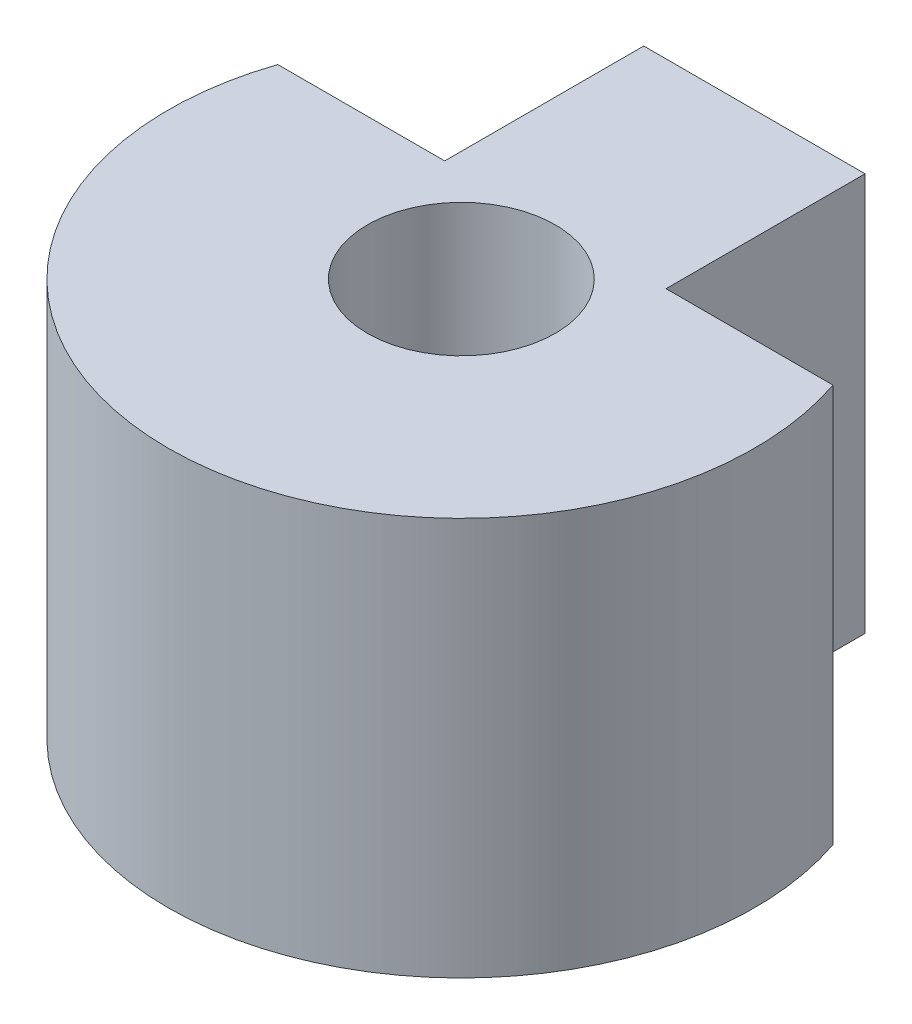
ISO-10303-21;
HEADER;
FILE_DESCRIPTION(('STEP AP214'),'2;1');
FILE_NAME('part.step','',(''),(''),'','','');
FILE_SCHEMA(('AUTOMOTIVE_DESIGN { 1 0 10303 214 1 1 1 1 }'));
ENDSEC;
DATA;
#1=APPLICATION_CONTEXT('core data for automotive mechanical design processes');
#2=APPLICATION_PROTOCOL_DEFINITION('international standard','automotive_design',2000,#1);
#3=PRODUCT_CONTEXT('',#1,'mechanical');
#4=PRODUCT('Part','Part','',(#3));
#5=PRODUCT_RELATED_PRODUCT_CATEGORY('part','',(#4));
#6=PRODUCT_DEFINITION_FORMATION('','',#4);
#7=PRODUCT_DEFINITION_CONTEXT('part definition',#1,'design');
#8=PRODUCT_DEFINITION('design','',#6,#7);
#9=PRODUCT_DEFINITION_SHAPE('','',#8);
#10=(LENGTH_UNIT() NAMED_UNIT(*) SI_UNIT(.MILLI.,.METRE.));
#11=(NAMED_UNIT(*) PLANE_ANGLE_UNIT() SI_UNIT($,.RADIAN.));
#12=(NAMED_UNIT(*) SI_UNIT($,.STERADIAN.) SOLID_ANGLE_UNIT());
#13=UNCERTAINTY_MEASURE_WITH_UNIT(LENGTH_MEASURE(1.E-05),#10,'distance_accuracy_value','');
#14=(GEOMETRIC_REPRESENTATION_CONTEXT(3) GLOBAL_UNCERTAINTY_ASSIGNED_CONTEXT((#13)) GLOBAL_UNIT_ASSIGNED_CONTEXT((#10,
#11,#12)) REPRESENTATION_CONTEXT('',''));
#15=CARTESIAN_POINT('',(0.,0.,0.));
#16=DIRECTION('',(0.,0.,1.));
#17=DIRECTION('',(1.,0.,0.));
#18=AXIS2_PLACEMENT_3D('',#15,#16,#17);
#19=CARTESIAN_POINT('',(0.,6.35,0.));
#20=DIRECTION('',(0.,1.,0.));
#21=DIRECTION('',(0.,0.,1.));
#22=AXIS2_PLACEMENT_3D('',#19,#20,#21);
#23=PLANE('',#22);
#24=DIRECTION('',(-1.,0.,0.));
#25=VECTOR('',#24,1.);
#26=CARTESIAN_POINT('',(-1.7653,6.35,-1.5));
#27=LINE('',#26,#25);
#28=CARTESIAN_POINT('',(-1.7653,6.35,-1.5));
#29=VERTEX_POINT('',#28);
#30=CARTESIAN_POINT('',(-4.42782395765685,6.35,-1.5));
#31=VERTEX_POINT('',#30);
#32=EDGE_CURVE('E126',#29,#31,#27,.T.);
#33=ORIENTED_EDGE('',*,*,#32,.T.);
#34=CARTESIAN_POINT('',(0.,6.35,0.));
#35=DIRECTION('',(0.,1.,0.));
#36=DIRECTION('',(0.,0.,1.));
#37=AXIS2_PLACEMENT_3D('',#34,#35,#36);
#38=CIRCLE('',#37,4.675);
#39=CARTESIAN_POINT('',(4.42782395765685,6.35,-1.5));
#40=VERTEX_POINT('',#39);
#41=EDGE_CURVE('E84',#31,#40,#38,.T.);
#42=ORIENTED_EDGE('',*,*,#41,.T.);
#43=DIRECTION('',(-1.,0.,0.));
#44=VECTOR('',#43,1.);
#45=CARTESIAN_POINT('',(1.7653,6.35,-1.5));
#46=LINE('',#45,#44);
#47=CARTESIAN_POINT('',(1.7653,6.35,-1.5));
#48=VERTEX_POINT('',#47);
#49=EDGE_CURVE('E97',#40,#48,#46,.T.);
#50=ORIENTED_EDGE('',*,*,#49,.T.);
#51=DIRECTION('',(0.,0.,-1.));
#52=VECTOR('',#51,1.);
#53=CARTESIAN_POINT('',(1.7653,6.35,-1.5));
#54=LINE('',#53,#52);
#55=CARTESIAN_POINT('',(1.7653,6.35,-4.675));
#56=VERTEX_POINT('',#55);
#57=EDGE_CURVE('E91',#48,#56,#54,.T.);
#58=ORIENTED_EDGE('',*,*,#57,.T.);
#59=DIRECTION('',(-1.,0.,0.));
#60=VECTOR('',#59,1.);
#61=CARTESIAN_POINT('',(-1.7653,6.35,-4.675));
#62=LINE('',#61,#60);
#63=CARTESIAN_POINT('',(-1.7653,6.35,-4.675));
#64=VERTEX_POINT('',#63);
#65=EDGE_CURVE('E95',#56,#64,#62,.T.);
#66=ORIENTED_EDGE('',*,*,#65,.T.);
#67=DIRECTION('',(0.,0.,1.));
#68=VECTOR('',#67,1.);
#69=CARTESIAN_POINT('',(-1.7653,6.35,-1.5));
#70=LINE('',#69,#68);
#71=EDGE_CURVE('E47',#64,#29,#70,.T.);
#72=ORIENTED_EDGE('',*,*,#71,.T.);
#73=EDGE_LOOP('',(#33,#42,#50,#58,#66,#72));
#74=FACE_BOUND('',#73,.T.);
#75=CARTESIAN_POINT('',(0.,6.35,0.));
#76=DIRECTION('',(0.,1.,0.));
#77=DIRECTION('',(0.,0.,1.));
#78=AXIS2_PLACEMENT_3D('',#75,#76,#77);
#79=CIRCLE('',#78,1.5);
#80=CARTESIAN_POINT('',(0.,6.35,1.5));
#81=VERTEX_POINT('',#80);
#82=EDGE_CURVE('E119',#81,#81,#79,.T.);
#83=ORIENTED_EDGE('',*,*,#82,.F.);
#84=EDGE_LOOP('',(#83));
#85=FACE_BOUND('',#84,.T.);
#86=ADVANCED_FACE('F30',(#74,#85),#23,.T.);
#87=CARTESIAN_POINT('',(0.,0.,0.));
#88=DIRECTION('',(0.,1.,0.));
#89=DIRECTION('',(0.,0.,1.));
#90=AXIS2_PLACEMENT_3D('',#87,#88,#89);
#91=PLANE('',#90);
#92=DIRECTION('',(-1.,0.,0.));
#93=VECTOR('',#92,1.);
#94=CARTESIAN_POINT('',(-1.7653,0.,-1.5));
#95=LINE('',#94,#93);
#96=CARTESIAN_POINT('',(-1.7653,0.,-1.5));
#97=VERTEX_POINT('',#96);
#98=CARTESIAN_POINT('',(-4.42782395765685,0.,-1.5));
#99=VERTEX_POINT('',#98);
#100=EDGE_CURVE('E115',#97,#99,#95,.T.);
#101=ORIENTED_EDGE('',*,*,#100,.F.);
#102=DIRECTION('',(0.,0.,1.));
#103=VECTOR('',#102,1.);
#104=CARTESIAN_POINT('',(-1.7653,0.,-1.5));
#105=LINE('',#104,#103);
#106=CARTESIAN_POINT('',(-1.7653,0.,-4.675));
#107=VERTEX_POINT('',#106);
#108=EDGE_CURVE('E76',#107,#97,#105,.T.);
#109=ORIENTED_EDGE('',*,*,#108,.F.);
#110=DIRECTION('',(-1.,0.,0.));
#111=VECTOR('',#110,1.);
#112=CARTESIAN_POINT('',(-1.7653,0.,-4.675));
#113=LINE('',#112,#111);
#114=CARTESIAN_POINT('',(1.7653,0.,-4.675));
#115=VERTEX_POINT('',#114);
#116=EDGE_CURVE('E70',#115,#107,#113,.T.);
#117=ORIENTED_EDGE('',*,*,#116,.F.);
#118=DIRECTION('',(0.,0.,-1.));
#119=VECTOR('',#118,1.);
#120=CARTESIAN_POINT('',(1.7653,0.,-1.5));
#121=LINE('',#120,#119);
#122=CARTESIAN_POINT('',(1.7653,0.,-1.5));
#123=VERTEX_POINT('',#122);
#124=EDGE_CURVE('E105',#123,#115,#121,.T.);
#125=ORIENTED_EDGE('',*,*,#124,.F.);
#126=DIRECTION('',(-1.,0.,0.));
#127=VECTOR('',#126,1.);
#128=CARTESIAN_POINT('',(1.7653,0.,-1.5));
#129=LINE('',#128,#127);
#130=CARTESIAN_POINT('',(4.42782395765685,0.,-1.5));
#131=VERTEX_POINT('',#130);
#132=EDGE_CURVE('E121',#131,#123,#129,.T.);
#133=ORIENTED_EDGE('',*,*,#132,.F.);
#134=CARTESIAN_POINT('',(0.,0.,0.));
#135=DIRECTION('',(0.,1.,0.));
#136=DIRECTION('',(0.,0.,1.));
#137=AXIS2_PLACEMENT_3D('',#134,#135,#136);
#138=CIRCLE('',#137,4.675);
#139=EDGE_CURVE('E118',#99,#131,#138,.T.);
#140=ORIENTED_EDGE('',*,*,#139,.F.);
#141=EDGE_LOOP('',(#101,#109,#117,#125,#133,#140));
#142=FACE_BOUND('',#141,.T.);
#143=CARTESIAN_POINT('',(0.,0.,0.));
#144=DIRECTION('',(0.,1.,0.));
#145=DIRECTION('',(0.,0.,1.));
#146=AXIS2_PLACEMENT_3D('',#143,#144,#145);
#147=CIRCLE('',#146,1.5);
#148=CARTESIAN_POINT('',(0.,0.,1.5));
#149=VERTEX_POINT('',#148);
#150=EDGE_CURVE('E219',#149,#149,#147,.T.);
#151=ORIENTED_EDGE('',*,*,#150,.T.);
#152=EDGE_LOOP('',(#151));
#153=FACE_BOUND('',#152,.T.);
#154=ADVANCED_FACE('F135',(#142,#153),#91,.F.);
#155=CARTESIAN_POINT('',(-1.7653,6.35,-1.5));
#156=DIRECTION('',(0.,0.,1.));
#157=DIRECTION('',(1.,0.,0.));
#158=AXIS2_PLACEMENT_3D('',#155,#156,#157);
#159=PLANE('',#158);
#160=ORIENTED_EDGE('',*,*,#100,.T.);
#161=DIRECTION('',(0.,-1.,0.));
#162=VECTOR('',#161,1.);
#163=CARTESIAN_POINT('',(-4.42782395765685,6.35,-1.5));
#164=LINE('',#163,#162);
#165=EDGE_CURVE('E11',#31,#99,#164,.T.);
#166=ORIENTED_EDGE('',*,*,#165,.F.);
#167=ORIENTED_EDGE('',*,*,#32,.F.);
#168=DIRECTION('',(0.,-1.,0.));
#169=VECTOR('',#168,1.);
#170=CARTESIAN_POINT('',(-1.7653,6.35,-1.5));
#171=LINE('',#170,#169);
#172=EDGE_CURVE('E111',#29,#97,#171,.T.);
#173=ORIENTED_EDGE('',*,*,#172,.T.);
#174=EDGE_LOOP('',(#160,#166,#167,#173));
#175=FACE_BOUND('',#174,.T.);
#176=ADVANCED_FACE('F32',(#175),#159,.F.);
#177=CARTESIAN_POINT('',(0.,6.35,0.));
#178=DIRECTION('',(0.,-1.,0.));
#179=DIRECTION('',(0.,0.,-1.));
#180=AXIS2_PLACEMENT_3D('',#177,#178,#179);
#181=CYLINDRICAL_SURFACE('',#180,4.675);
#182=ORIENTED_EDGE('',*,*,#139,.T.);
#183=DIRECTION('',(0.,-1.,0.));
#184=VECTOR('',#183,1.);
#185=CARTESIAN_POINT('',(4.42782395765685,6.35,-1.5));
#186=LINE('',#185,#184);
#187=EDGE_CURVE('E39',#40,#131,#186,.T.);
#188=ORIENTED_EDGE('',*,*,#187,.F.);
#189=ORIENTED_EDGE('',*,*,#41,.F.);
#190=ORIENTED_EDGE('',*,*,#165,.T.);
#191=EDGE_LOOP('',(#182,#188,#189,#190));
#192=FACE_BOUND('',#191,.T.);
#193=ADVANCED_FACE('F160',(#192),#181,.T.);
#194=CARTESIAN_POINT('',(1.7653,6.35,-1.5));
#195=DIRECTION('',(0.,0.,1.));
#196=DIRECTION('',(1.,0.,0.));
#197=AXIS2_PLACEMENT_3D('',#194,#195,#196);
#198=PLANE('',#197);
#199=ORIENTED_EDGE('',*,*,#132,.T.);
#200=DIRECTION('',(0.,-1.,0.));
#201=VECTOR('',#200,1.);
#202=CARTESIAN_POINT('',(1.7653,6.35,-1.5));
#203=LINE('',#202,#201);
#204=EDGE_CURVE('E106',#48,#123,#203,.T.);
#205=ORIENTED_EDGE('',*,*,#204,.F.);
#206=ORIENTED_EDGE('',*,*,#49,.F.);
#207=ORIENTED_EDGE('',*,*,#187,.T.);
#208=EDGE_LOOP('',(#199,#205,#206,#207));
#209=FACE_BOUND('',#208,.T.);
#210=ADVANCED_FACE('F132',(#209),#198,.F.);
#211=CARTESIAN_POINT('',(1.7653,6.35,-1.5));
#212=DIRECTION('',(-1.,0.,0.));
#213=DIRECTION('',(0.,0.,1.));
#214=AXIS2_PLACEMENT_3D('',#211,#212,#213);
#215=PLANE('',#214);
#216=ORIENTED_EDGE('',*,*,#124,.T.);
#217=DIRECTION('',(0.,-1.,0.));
#218=VECTOR('',#217,1.);
#219=CARTESIAN_POINT('',(1.7653,6.35,-4.675));
#220=LINE('',#219,#218);
#221=EDGE_CURVE('E102',#56,#115,#220,.T.);
#222=ORIENTED_EDGE('',*,*,#221,.F.);
#223=ORIENTED_EDGE('',*,*,#57,.F.);
#224=ORIENTED_EDGE('',*,*,#204,.T.);
#225=EDGE_LOOP('',(#216,#222,#223,#224));
#226=FACE_BOUND('',#225,.T.);
#227=ADVANCED_FACE('F103',(#226),#215,.F.);
#228=CARTESIAN_POINT('',(-1.7653,6.35,-4.675));
#229=DIRECTION('',(0.,0.,1.));
#230=DIRECTION('',(1.,0.,0.));
#231=AXIS2_PLACEMENT_3D('',#228,#229,#230);
#232=PLANE('',#231);
#233=ORIENTED_EDGE('',*,*,#116,.T.);
#234=DIRECTION('',(0.,-1.,0.));
#235=VECTOR('',#234,1.);
#236=CARTESIAN_POINT('',(-1.7653,6.35,-4.675));
#237=LINE('',#236,#235);
#238=EDGE_CURVE('E107',#64,#107,#237,.T.);
#239=ORIENTED_EDGE('',*,*,#238,.F.);
#240=ORIENTED_EDGE('',*,*,#65,.F.);
#241=ORIENTED_EDGE('',*,*,#221,.T.);
#242=EDGE_LOOP('',(#233,#239,#240,#241));
#243=FACE_BOUND('',#242,.T.);
#244=ADVANCED_FACE('F109',(#243),#232,.F.);
#245=CARTESIAN_POINT('',(-1.7653,6.35,-1.5));
#246=DIRECTION('',(1.,0.,0.));
#247=DIRECTION('',(0.,0.,-1.));
#248=AXIS2_PLACEMENT_3D('',#245,#246,#247);
#249=PLANE('',#248);
#250=ORIENTED_EDGE('',*,*,#108,.T.);
#251=ORIENTED_EDGE('',*,*,#172,.F.);
#252=ORIENTED_EDGE('',*,*,#71,.F.);
#253=ORIENTED_EDGE('',*,*,#238,.T.);
#254=EDGE_LOOP('',(#250,#251,#252,#253));
#255=FACE_BOUND('',#254,.T.);
#256=ADVANCED_FACE('F140',(#255),#249,.F.);
#257=CARTESIAN_POINT('',(0.,6.35,0.));
#258=DIRECTION('',(0.,-1.,0.));
#259=DIRECTION('',(0.,0.,-1.));
#260=AXIS2_PLACEMENT_3D('',#257,#258,#259);
#261=CYLINDRICAL_SURFACE('',#260,1.5);
#262=ORIENTED_EDGE('',*,*,#82,.T.);
#263=EDGE_LOOP('',(#262));
#264=FACE_BOUND('',#263,.T.);
#265=ORIENTED_EDGE('',*,*,#150,.F.);
#266=EDGE_LOOP('',(#265));
#267=FACE_BOUND('',#266,.T.);
#268=ADVANCED_FACE('F142',(#264,#267),#261,.F.);
#269=CLOSED_SHELL('',(#86,#154,#176,#193,#210,#227,#244,#256,#268));
#270=MANIFOLD_SOLID_BREP('B2',#269);
#271=ADVANCED_BREP_SHAPE_REPRESENTATION('',(#18,#270),#14);
#272=SHAPE_DEFINITION_REPRESENTATION(#9,#271);
ENDSEC;
END-ISO-10303-21;
